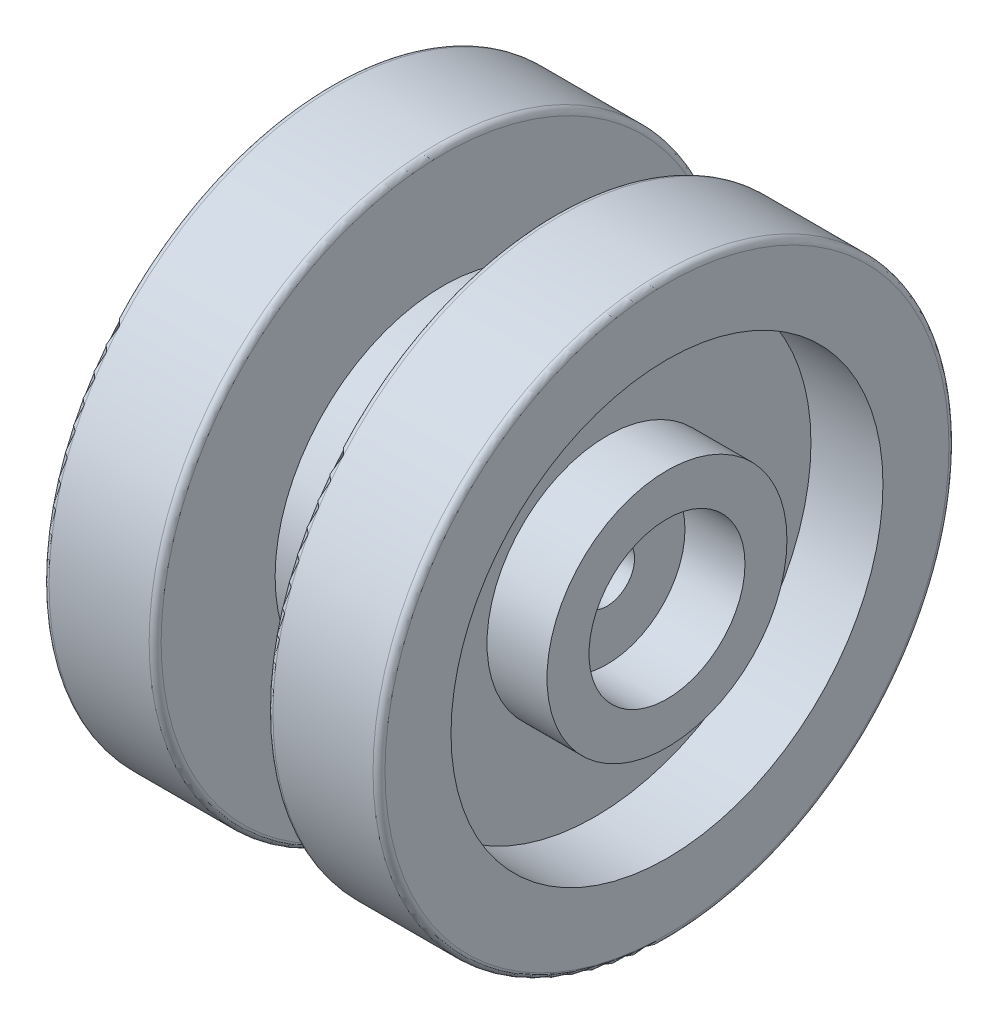
ISO-10303-21;
HEADER;
FILE_DESCRIPTION(('STEP AP214'),'2;1');
FILE_NAME('part.step','',(''),(''),'','','');
FILE_SCHEMA(('AUTOMOTIVE_DESIGN { 1 0 10303 214 1 1 1 1 }'));
ENDSEC;
DATA;
#1=APPLICATION_CONTEXT('core data for automotive mechanical design processes');
#2=APPLICATION_PROTOCOL_DEFINITION('international standard','automotive_design',2000,#1);
#3=PRODUCT_CONTEXT('',#1,'mechanical');
#4=PRODUCT('Part','Part','',(#3));
#5=PRODUCT_RELATED_PRODUCT_CATEGORY('part','',(#4));
#6=PRODUCT_DEFINITION_FORMATION('','',#4);
#7=PRODUCT_DEFINITION_CONTEXT('part definition',#1,'design');
#8=PRODUCT_DEFINITION('design','',#6,#7);
#9=PRODUCT_DEFINITION_SHAPE('','',#8);
#10=(LENGTH_UNIT() NAMED_UNIT(*) SI_UNIT(.MILLI.,.METRE.));
#11=(NAMED_UNIT(*) PLANE_ANGLE_UNIT() SI_UNIT($,.RADIAN.));
#12=(NAMED_UNIT(*) SI_UNIT($,.STERADIAN.) SOLID_ANGLE_UNIT());
#13=UNCERTAINTY_MEASURE_WITH_UNIT(LENGTH_MEASURE(1.E-05),#10,'distance_accuracy_value','');
#14=(GEOMETRIC_REPRESENTATION_CONTEXT(3) GLOBAL_UNCERTAINTY_ASSIGNED_CONTEXT((#13)) GLOBAL_UNIT_ASSIGNED_CONTEXT((#10,
#11,#12)) REPRESENTATION_CONTEXT('',''));
#15=CARTESIAN_POINT('',(0.,0.,0.));
#16=DIRECTION('',(0.,0.,1.));
#17=DIRECTION('',(1.,0.,0.));
#18=AXIS2_PLACEMENT_3D('',#15,#16,#17);
#19=CARTESIAN_POINT('',(6.57479912463906,-18.4842605379604,0.));
#20=DIRECTION('',(1.,0.,0.));
#21=DIRECTION('',(0.,0.,-1.));
#22=AXIS2_PLACEMENT_3D('',#19,#20,#21);
#23=CYLINDRICAL_SURFACE('',#22,8.);
#24=CARTESIAN_POINT('',(10.5747991246391,-18.4842605379604,0.));
#25=DIRECTION('',(1.,0.,0.));
#26=DIRECTION('',(0.,0.,-1.));
#27=AXIS2_PLACEMENT_3D('',#24,#25,#26);
#28=CIRCLE('',#27,8.);
#29=CARTESIAN_POINT('',(10.5747991246391,-18.4842605379604,-8.));
#30=VERTEX_POINT('',#29);
#31=EDGE_CURVE('E10',#30,#30,#28,.T.);
#32=ORIENTED_EDGE('',*,*,#31,.T.);
#33=EDGE_LOOP('',(#32));
#34=FACE_BOUND('',#33,.T.);
#35=CARTESIAN_POINT('',(11.5747991246391,-18.4842605379604,0.));
#36=DIRECTION('',(1.,0.,0.));
#37=DIRECTION('',(0.,0.,-1.));
#38=AXIS2_PLACEMENT_3D('',#35,#36,#37);
#39=CIRCLE('',#38,8.);
#40=CARTESIAN_POINT('',(11.5747991246391,-18.4842605379604,-8.));
#41=VERTEX_POINT('',#40);
#42=EDGE_CURVE('E54',#41,#41,#39,.F.);
#43=ORIENTED_EDGE('',*,*,#42,.T.);
#44=EDGE_LOOP('',(#43));
#45=FACE_BOUND('',#44,.T.);
#46=ADVANCED_FACE('F39',(#34,#45),#23,.T.);
#47=CARTESIAN_POINT('',(-2.08520087536094,-4.48426053796036,0.));
#48=DIRECTION('',(-1.,0.,0.));
#49=DIRECTION('',(0.,0.,1.));
#50=AXIS2_PLACEMENT_3D('',#47,#48,#49);
#51=PLANE('',#50);
#52=CARTESIAN_POINT('',(-2.08520087536094,-18.4842605379604,0.));
#53=DIRECTION('',(-1.,0.,0.));
#54=DIRECTION('',(0.,0.,1.));
#55=AXIS2_PLACEMENT_3D('',#52,#53,#54);
#56=CIRCLE('',#55,23.5);
#57=CARTESIAN_POINT('',(-2.08520087536094,-18.4842605379604,23.5));
#58=VERTEX_POINT('',#57);
#59=EDGE_CURVE('E55',#58,#58,#56,.F.);
#60=ORIENTED_EDGE('',*,*,#59,.T.);
#61=EDGE_LOOP('',(#60));
#62=FACE_BOUND('',#61,.T.);
#63=CARTESIAN_POINT('',(-2.08520087536094,-18.4842605379604,0.));
#64=DIRECTION('',(-1.,0.,0.));
#65=DIRECTION('',(0.,0.,1.));
#66=AXIS2_PLACEMENT_3D('',#63,#64,#65);
#67=CIRCLE('',#66,14.);
#68=CARTESIAN_POINT('',(-2.08520087536094,-18.4842605379604,14.));
#69=VERTEX_POINT('',#68);
#70=EDGE_CURVE('E94',#69,#69,#67,.T.);
#71=ORIENTED_EDGE('',*,*,#70,.T.);
#72=EDGE_LOOP('',(#71));
#73=FACE_BOUND('',#72,.T.);
#74=ADVANCED_FACE('F125',(#62,#73),#51,.F.);
#75=CARTESIAN_POINT('',(-11.4252008753609,-18.4842605379604,0.));
#76=DIRECTION('',(-1.,0.,0.));
#77=DIRECTION('',(0.,0.,1.));
#78=AXIS2_PLACEMENT_3D('',#75,#76,#77);
#79=CYLINDRICAL_SURFACE('',#78,24.);
#80=CARTESIAN_POINT('',(-10.9252008753609,-18.4842605379604,0.));
#81=DIRECTION('',(1.,0.,0.));
#82=DIRECTION('',(0.,0.,-1.));
#83=AXIS2_PLACEMENT_3D('',#80,#81,#82);
#84=CIRCLE('',#83,24.);
#85=CARTESIAN_POINT('',(-10.9252008753609,-18.4842605379604,-24.));
#86=VERTEX_POINT('',#85);
#87=EDGE_CURVE('E120',#86,#86,#84,.T.);
#88=ORIENTED_EDGE('',*,*,#87,.T.);
#89=EDGE_LOOP('',(#88));
#90=FACE_BOUND('',#89,.T.);
#91=CARTESIAN_POINT('',(-2.58520087536094,-18.4842605379604,0.));
#92=DIRECTION('',(-1.,0.,0.));
#93=DIRECTION('',(0.,0.,1.));
#94=AXIS2_PLACEMENT_3D('',#91,#92,#93);
#95=CIRCLE('',#94,24.);
#96=CARTESIAN_POINT('',(-2.58520087536094,-18.4842605379604,24.));
#97=VERTEX_POINT('',#96);
#98=EDGE_CURVE('E112',#97,#97,#95,.T.);
#99=ORIENTED_EDGE('',*,*,#98,.T.);
#100=EDGE_LOOP('',(#99));
#101=FACE_BOUND('',#100,.T.);
#102=ADVANCED_FACE('F132',(#90,#101),#79,.T.);
#103=CARTESIAN_POINT('',(-11.4252008753609,5.51573946203964,0.));
#104=DIRECTION('',(1.,0.,0.));
#105=DIRECTION('',(0.,0.,-1.));
#106=AXIS2_PLACEMENT_3D('',#103,#104,#105);
#107=PLANE('',#106);
#108=CARTESIAN_POINT('',(-11.4252008753609,-18.4842605379604,0.));
#109=DIRECTION('',(-1.,0.,0.));
#110=DIRECTION('',(0.,0.,1.));
#111=AXIS2_PLACEMENT_3D('',#108,#109,#110);
#112=CIRCLE('',#111,18.);
#113=CARTESIAN_POINT('',(-11.4252008753609,-18.4842605379604,18.));
#114=VERTEX_POINT('',#113);
#115=EDGE_CURVE('E85',#114,#114,#112,.T.);
#116=ORIENTED_EDGE('',*,*,#115,.F.);
#117=EDGE_LOOP('',(#116));
#118=FACE_BOUND('',#117,.T.);
#119=CARTESIAN_POINT('',(-11.4252008753609,-18.4842605379604,0.));
#120=DIRECTION('',(1.,0.,0.));
#121=DIRECTION('',(0.,0.,-1.));
#122=AXIS2_PLACEMENT_3D('',#119,#120,#121);
#123=CIRCLE('',#122,23.5);
#124=CARTESIAN_POINT('',(-11.4252008753609,-18.4842605379604,-23.5));
#125=VERTEX_POINT('',#124);
#126=EDGE_CURVE('E111',#125,#125,#123,.F.);
#127=ORIENTED_EDGE('',*,*,#126,.T.);
#128=EDGE_LOOP('',(#127));
#129=FACE_BOUND('',#128,.T.);
#130=ADVANCED_FACE('F135',(#118,#129),#107,.F.);
#131=CARTESIAN_POINT('',(16.5747991246391,-18.4842605379604,0.));
#132=DIRECTION('',(-1.,0.,0.));
#133=DIRECTION('',(0.,0.,1.));
#134=AXIS2_PLACEMENT_3D('',#131,#132,#133);
#135=PLANE('',#134);
#136=CARTESIAN_POINT('',(16.5747991246391,-18.4842605379604,0.));
#137=DIRECTION('',(1.,0.,0.));
#138=DIRECTION('',(0.,0.,-1.));
#139=AXIS2_PLACEMENT_3D('',#136,#137,#138);
#140=CIRCLE('',#139,18.);
#141=CARTESIAN_POINT('',(16.5747991246391,-18.4842605379604,-18.));
#142=VERTEX_POINT('',#141);
#143=EDGE_CURVE('E90',#142,#142,#140,.T.);
#144=ORIENTED_EDGE('',*,*,#143,.F.);
#145=EDGE_LOOP('',(#144));
#146=FACE_BOUND('',#145,.T.);
#147=CARTESIAN_POINT('',(16.5747991246391,-18.4842605379604,0.));
#148=DIRECTION('',(-1.,0.,0.));
#149=DIRECTION('',(0.,0.,1.));
#150=AXIS2_PLACEMENT_3D('',#147,#148,#149);
#151=CIRCLE('',#150,23.5);
#152=CARTESIAN_POINT('',(16.5747991246391,-18.4842605379604,23.5));
#153=VERTEX_POINT('',#152);
#154=EDGE_CURVE('E108',#153,#153,#151,.F.);
#155=ORIENTED_EDGE('',*,*,#154,.T.);
#156=EDGE_LOOP('',(#155));
#157=FACE_BOUND('',#156,.T.);
#158=ADVANCED_FACE('F142',(#146,#157),#135,.F.);
#159=CARTESIAN_POINT('',(-11.4252008753609,-18.4842605379604,0.));
#160=DIRECTION('',(-1.,0.,0.));
#161=DIRECTION('',(0.,0.,1.));
#162=AXIS2_PLACEMENT_3D('',#159,#160,#161);
#163=CYLINDRICAL_SURFACE('',#162,24.);
#164=CARTESIAN_POINT('',(16.0747991246391,-18.4842605379604,0.));
#165=DIRECTION('',(-1.,0.,0.));
#166=DIRECTION('',(0.,0.,1.));
#167=AXIS2_PLACEMENT_3D('',#164,#165,#166);
#168=CIRCLE('',#167,24.);
#169=CARTESIAN_POINT('',(16.0747991246391,-18.4842605379604,24.));
#170=VERTEX_POINT('',#169);
#171=EDGE_CURVE('E102',#170,#170,#168,.T.);
#172=ORIENTED_EDGE('',*,*,#171,.T.);
#173=EDGE_LOOP('',(#172));
#174=FACE_BOUND('',#173,.T.);
#175=CARTESIAN_POINT('',(7.73479912463906,-18.4842605379604,0.));
#176=DIRECTION('',(1.,0.,0.));
#177=DIRECTION('',(0.,0.,-1.));
#178=AXIS2_PLACEMENT_3D('',#175,#176,#177);
#179=CIRCLE('',#178,24.);
#180=CARTESIAN_POINT('',(7.73479912463906,-18.4842605379604,-24.));
#181=VERTEX_POINT('',#180);
#182=EDGE_CURVE('E105',#181,#181,#179,.T.);
#183=ORIENTED_EDGE('',*,*,#182,.T.);
#184=EDGE_LOOP('',(#183));
#185=FACE_BOUND('',#184,.T.);
#186=ADVANCED_FACE('F190',(#174,#185),#163,.T.);
#187=CARTESIAN_POINT('',(7.23479912463906,-4.48426053796036,0.));
#188=DIRECTION('',(1.,0.,0.));
#189=DIRECTION('',(0.,0.,-1.));
#190=AXIS2_PLACEMENT_3D('',#187,#188,#189);
#191=PLANE('',#190);
#192=CARTESIAN_POINT('',(7.23479912463906,-18.4842605379604,0.));
#193=DIRECTION('',(1.,0.,0.));
#194=DIRECTION('',(0.,0.,-1.));
#195=AXIS2_PLACEMENT_3D('',#192,#193,#194);
#196=CIRCLE('',#195,23.5);
#197=CARTESIAN_POINT('',(7.23479912463906,-18.4842605379604,-23.5));
#198=VERTEX_POINT('',#197);
#199=EDGE_CURVE('E50',#198,#198,#196,.F.);
#200=ORIENTED_EDGE('',*,*,#199,.T.);
#201=EDGE_LOOP('',(#200));
#202=FACE_BOUND('',#201,.T.);
#203=CARTESIAN_POINT('',(7.23479912463906,-18.4842605379604,0.));
#204=DIRECTION('',(-1.,0.,0.));
#205=DIRECTION('',(0.,0.,1.));
#206=AXIS2_PLACEMENT_3D('',#203,#204,#205);
#207=CIRCLE('',#206,14.);
#208=CARTESIAN_POINT('',(7.23479912463906,-18.4842605379604,14.));
#209=VERTEX_POINT('',#208);
#210=EDGE_CURVE('E100',#209,#209,#207,.T.);
#211=ORIENTED_EDGE('',*,*,#210,.F.);
#212=EDGE_LOOP('',(#211));
#213=FACE_BOUND('',#212,.T.);
#214=ADVANCED_FACE('F182',(#202,#213),#191,.F.);
#215=CARTESIAN_POINT('',(-11.4252008753609,-18.4842605379604,0.));
#216=DIRECTION('',(-1.,0.,0.));
#217=DIRECTION('',(0.,0.,1.));
#218=AXIS2_PLACEMENT_3D('',#215,#216,#217);
#219=CYLINDRICAL_SURFACE('',#218,14.);
#220=ORIENTED_EDGE('',*,*,#70,.F.);
#221=EDGE_LOOP('',(#220));
#222=FACE_BOUND('',#221,.T.);
#223=ORIENTED_EDGE('',*,*,#210,.T.);
#224=EDGE_LOOP('',(#223));
#225=FACE_BOUND('',#224,.T.);
#226=ADVANCED_FACE('F177',(#222,#225),#219,.T.);
#227=CARTESIAN_POINT('',(16.0747991246391,-18.4842605379604,0.));
#228=DIRECTION('',(-1.,0.,0.));
#229=DIRECTION('',(0.,0.,1.));
#230=AXIS2_PLACEMENT_3D('',#227,#228,#229);
#231=TOROIDAL_SURFACE('',#230,23.5,0.5);
#232=ORIENTED_EDGE('',*,*,#154,.F.);
#233=EDGE_LOOP('',(#232));
#234=FACE_BOUND('',#233,.T.);
#235=ORIENTED_EDGE('',*,*,#171,.F.);
#236=EDGE_LOOP('',(#235));
#237=FACE_BOUND('',#236,.T.);
#238=ADVANCED_FACE('F185',(#234,#237),#231,.T.);
#239=CARTESIAN_POINT('',(-10.9252008753609,-18.4842605379604,0.));
#240=DIRECTION('',(1.,0.,0.));
#241=DIRECTION('',(0.,0.,-1.));
#242=AXIS2_PLACEMENT_3D('',#239,#240,#241);
#243=TOROIDAL_SURFACE('',#242,23.5,0.5);
#244=ORIENTED_EDGE('',*,*,#87,.F.);
#245=EDGE_LOOP('',(#244));
#246=FACE_BOUND('',#245,.T.);
#247=ORIENTED_EDGE('',*,*,#126,.F.);
#248=EDGE_LOOP('',(#247));
#249=FACE_BOUND('',#248,.T.);
#250=ADVANCED_FACE('F127',(#246,#249),#243,.T.);
#251=CARTESIAN_POINT('',(-2.58520087536094,-18.4842605379604,0.));
#252=DIRECTION('',(-1.,0.,0.));
#253=DIRECTION('',(0.,0.,1.));
#254=AXIS2_PLACEMENT_3D('',#251,#252,#253);
#255=TOROIDAL_SURFACE('',#254,23.5,0.5);
#256=ORIENTED_EDGE('',*,*,#59,.F.);
#257=EDGE_LOOP('',(#256));
#258=FACE_BOUND('',#257,.T.);
#259=ORIENTED_EDGE('',*,*,#98,.F.);
#260=EDGE_LOOP('',(#259));
#261=FACE_BOUND('',#260,.T.);
#262=ADVANCED_FACE('F123',(#258,#261),#255,.T.);
#263=CARTESIAN_POINT('',(7.73479912463906,-18.4842605379604,0.));
#264=DIRECTION('',(1.,0.,0.));
#265=DIRECTION('',(0.,0.,-1.));
#266=AXIS2_PLACEMENT_3D('',#263,#264,#265);
#267=TOROIDAL_SURFACE('',#266,23.5,0.5);
#268=ORIENTED_EDGE('',*,*,#182,.F.);
#269=EDGE_LOOP('',(#268));
#270=FACE_BOUND('',#269,.T.);
#271=ORIENTED_EDGE('',*,*,#199,.F.);
#272=EDGE_LOOP('',(#271));
#273=FACE_BOUND('',#272,.T.);
#274=ADVANCED_FACE('F41',(#270,#273),#267,.T.);
#275=CARTESIAN_POINT('',(10.5747991246391,-18.4842605379604,0.));
#276=DIRECTION('',(1.,0.,0.));
#277=DIRECTION('',(0.,0.,-1.));
#278=AXIS2_PLACEMENT_3D('',#275,#276,#277);
#279=CYLINDRICAL_SURFACE('',#278,18.);
#280=CARTESIAN_POINT('',(10.5747991246391,-18.4842605379604,0.));
#281=DIRECTION('',(1.,0.,0.));
#282=DIRECTION('',(0.,0.,-1.));
#283=AXIS2_PLACEMENT_3D('',#280,#281,#282);
#284=CIRCLE('',#283,18.);
#285=CARTESIAN_POINT('',(10.5747991246391,-18.4842605379604,-18.));
#286=VERTEX_POINT('',#285);
#287=EDGE_CURVE('E92',#286,#286,#284,.T.);
#288=ORIENTED_EDGE('',*,*,#287,.F.);
#289=EDGE_LOOP('',(#288));
#290=FACE_BOUND('',#289,.T.);
#291=ORIENTED_EDGE('',*,*,#143,.T.);
#292=EDGE_LOOP('',(#291));
#293=FACE_BOUND('',#292,.T.);
#294=ADVANCED_FACE('F172',(#290,#293),#279,.F.);
#295=CARTESIAN_POINT('',(10.5747991246391,-18.4842605379604,0.));
#296=DIRECTION('',(1.,0.,0.));
#297=DIRECTION('',(0.,0.,-1.));
#298=AXIS2_PLACEMENT_3D('',#295,#296,#297);
#299=PLANE('',#298);
#300=ORIENTED_EDGE('',*,*,#31,.F.);
#301=EDGE_LOOP('',(#300));
#302=FACE_BOUND('',#301,.T.);
#303=ORIENTED_EDGE('',*,*,#287,.T.);
#304=EDGE_LOOP('',(#303));
#305=FACE_BOUND('',#304,.T.);
#306=ADVANCED_FACE('F170',(#302,#305),#299,.T.);
#307=CARTESIAN_POINT('',(-5.42520087536094,-18.4842605379604,0.));
#308=DIRECTION('',(-1.,0.,0.));
#309=DIRECTION('',(0.,0.,1.));
#310=AXIS2_PLACEMENT_3D('',#307,#308,#309);
#311=PLANE('',#310);
#312=CARTESIAN_POINT('',(-5.42520087536094,-18.4842605379604,0.));
#313=DIRECTION('',(-1.,0.,0.));
#314=DIRECTION('',(0.,0.,1.));
#315=AXIS2_PLACEMENT_3D('',#312,#313,#314);
#316=CIRCLE('',#315,10.);
#317=CARTESIAN_POINT('',(-5.42520087536094,-18.4842605379604,10.));
#318=VERTEX_POINT('',#317);
#319=EDGE_CURVE('E80',#318,#318,#316,.T.);
#320=ORIENTED_EDGE('',*,*,#319,.F.);
#321=EDGE_LOOP('',(#320));
#322=FACE_BOUND('',#321,.T.);
#323=CARTESIAN_POINT('',(-5.42520087536094,-18.4842605379604,0.));
#324=DIRECTION('',(-1.,0.,0.));
#325=DIRECTION('',(0.,0.,1.));
#326=AXIS2_PLACEMENT_3D('',#323,#324,#325);
#327=CIRCLE('',#326,18.);
#328=CARTESIAN_POINT('',(-5.42520087536094,-18.4842605379604,18.));
#329=VERTEX_POINT('',#328);
#330=EDGE_CURVE('E84',#329,#329,#327,.T.);
#331=ORIENTED_EDGE('',*,*,#330,.T.);
#332=EDGE_LOOP('',(#331));
#333=FACE_BOUND('',#332,.T.);
#334=ADVANCED_FACE('F165',(#322,#333),#311,.T.);
#335=CARTESIAN_POINT('',(-5.42520087536094,-18.4842605379604,0.));
#336=DIRECTION('',(-1.,0.,0.));
#337=DIRECTION('',(0.,0.,1.));
#338=AXIS2_PLACEMENT_3D('',#335,#336,#337);
#339=CYLINDRICAL_SURFACE('',#338,18.);
#340=ORIENTED_EDGE('',*,*,#330,.F.);
#341=EDGE_LOOP('',(#340));
#342=FACE_BOUND('',#341,.T.);
#343=ORIENTED_EDGE('',*,*,#115,.T.);
#344=EDGE_LOOP('',(#343));
#345=FACE_BOUND('',#344,.T.);
#346=ADVANCED_FACE('F159',(#342,#345),#339,.F.);
#347=CARTESIAN_POINT('',(-11.4252008753609,-18.4842605379604,0.));
#348=DIRECTION('',(-1.,0.,0.));
#349=DIRECTION('',(0.,0.,1.));
#350=AXIS2_PLACEMENT_3D('',#347,#348,#349);
#351=PLANE('',#350);
#352=CARTESIAN_POINT('',(-11.4252008753609,-18.4842605379604,0.));
#353=DIRECTION('',(-1.,0.,0.));
#354=DIRECTION('',(0.,0.,1.));
#355=AXIS2_PLACEMENT_3D('',#352,#353,#354);
#356=CIRCLE('',#355,6.5);
#357=CARTESIAN_POINT('',(-11.4252008753609,-18.4842605379604,6.5));
#358=VERTEX_POINT('',#357);
#359=EDGE_CURVE('E60',#358,#358,#356,.T.);
#360=ORIENTED_EDGE('',*,*,#359,.F.);
#361=EDGE_LOOP('',(#360));
#362=FACE_BOUND('',#361,.T.);
#363=CARTESIAN_POINT('',(-11.4252008753609,-18.4842605379604,0.));
#364=DIRECTION('',(-1.,0.,0.));
#365=DIRECTION('',(0.,0.,1.));
#366=AXIS2_PLACEMENT_3D('',#363,#364,#365);
#367=CIRCLE('',#366,10.);
#368=CARTESIAN_POINT('',(-11.4252008753609,-18.4842605379604,10.));
#369=VERTEX_POINT('',#368);
#370=EDGE_CURVE('E79',#369,#369,#367,.T.);
#371=ORIENTED_EDGE('',*,*,#370,.T.);
#372=EDGE_LOOP('',(#371));
#373=FACE_BOUND('',#372,.T.);
#374=ADVANCED_FACE('F153',(#362,#373),#351,.T.);
#375=CARTESIAN_POINT('',(-11.4252008753609,-18.4842605379604,0.));
#376=DIRECTION('',(1.,0.,0.));
#377=DIRECTION('',(0.,0.,-1.));
#378=AXIS2_PLACEMENT_3D('',#375,#376,#377);
#379=CYLINDRICAL_SURFACE('',#378,10.);
#380=ORIENTED_EDGE('',*,*,#370,.F.);
#381=EDGE_LOOP('',(#380));
#382=FACE_BOUND('',#381,.T.);
#383=ORIENTED_EDGE('',*,*,#319,.T.);
#384=EDGE_LOOP('',(#383));
#385=FACE_BOUND('',#384,.T.);
#386=ADVANCED_FACE('F158',(#382,#385),#379,.T.);
#387=CARTESIAN_POINT('',(-6.42520087536094,-18.4842605379604,0.));
#388=DIRECTION('',(-1.,0.,0.));
#389=DIRECTION('',(0.,0.,1.));
#390=AXIS2_PLACEMENT_3D('',#387,#388,#389);
#391=CYLINDRICAL_SURFACE('',#390,6.5);
#392=CARTESIAN_POINT('',(-6.42520087536094,-18.4842605379604,0.));
#393=DIRECTION('',(-1.,0.,0.));
#394=DIRECTION('',(0.,0.,1.));
#395=AXIS2_PLACEMENT_3D('',#392,#393,#394);
#396=CIRCLE('',#395,6.5);
#397=CARTESIAN_POINT('',(-6.42520087536094,-18.4842605379604,6.5));
#398=VERTEX_POINT('',#397);
#399=EDGE_CURVE('E65',#398,#398,#396,.T.);
#400=ORIENTED_EDGE('',*,*,#399,.F.);
#401=EDGE_LOOP('',(#400));
#402=FACE_BOUND('',#401,.T.);
#403=ORIENTED_EDGE('',*,*,#359,.T.);
#404=EDGE_LOOP('',(#403));
#405=FACE_BOUND('',#404,.T.);
#406=ADVANCED_FACE('F155',(#402,#405),#391,.F.);
#407=CARTESIAN_POINT('',(-6.42520087536094,-18.4842605379604,0.));
#408=DIRECTION('',(-1.,0.,0.));
#409=DIRECTION('',(0.,0.,1.));
#410=AXIS2_PLACEMENT_3D('',#407,#408,#409);
#411=PLANE('',#410);
#412=CARTESIAN_POINT('',(-6.42520087536094,-18.4842605379604,0.));
#413=DIRECTION('',(-1.,0.,0.));
#414=DIRECTION('',(0.,0.,1.));
#415=AXIS2_PLACEMENT_3D('',#412,#413,#414);
#416=CIRCLE('',#415,2.3);
#417=CARTESIAN_POINT('',(-6.42520087536094,-18.4842605379604,2.3));
#418=VERTEX_POINT('',#417);
#419=EDGE_CURVE('E236',#418,#418,#416,.T.);
#420=ORIENTED_EDGE('',*,*,#419,.F.);
#421=EDGE_LOOP('',(#420));
#422=FACE_BOUND('',#421,.T.);
#423=ORIENTED_EDGE('',*,*,#399,.T.);
#424=EDGE_LOOP('',(#423));
#425=FACE_BOUND('',#424,.T.);
#426=ADVANCED_FACE('F220',(#422,#425),#411,.T.);
#427=CARTESIAN_POINT('',(11.5747991246391,-18.4842605379604,0.));
#428=DIRECTION('',(1.,0.,0.));
#429=DIRECTION('',(0.,0.,-1.));
#430=AXIS2_PLACEMENT_3D('',#427,#428,#429);
#431=CYLINDRICAL_SURFACE('',#430,10.);
#432=CARTESIAN_POINT('',(11.5747991246391,-18.4842605379604,0.));
#433=DIRECTION('',(1.,0.,0.));
#434=DIRECTION('',(0.,0.,-1.));
#435=AXIS2_PLACEMENT_3D('',#432,#433,#434);
#436=CIRCLE('',#435,10.);
#437=CARTESIAN_POINT('',(11.5747991246391,-18.4842605379604,-10.));
#438=VERTEX_POINT('',#437);
#439=EDGE_CURVE('E59',#438,#438,#436,.T.);
#440=ORIENTED_EDGE('',*,*,#439,.T.);
#441=EDGE_LOOP('',(#440));
#442=FACE_BOUND('',#441,.T.);
#443=CARTESIAN_POINT('',(16.5747991246391,-18.4842605379604,0.));
#444=DIRECTION('',(1.,0.,0.));
#445=DIRECTION('',(0.,0.,-1.));
#446=AXIS2_PLACEMENT_3D('',#443,#444,#445);
#447=CIRCLE('',#446,10.);
#448=CARTESIAN_POINT('',(16.5747991246391,-18.4842605379604,-10.));
#449=VERTEX_POINT('',#448);
#450=EDGE_CURVE('E64',#449,#449,#447,.T.);
#451=ORIENTED_EDGE('',*,*,#450,.F.);
#452=EDGE_LOOP('',(#451));
#453=FACE_BOUND('',#452,.T.);
#454=ADVANCED_FACE('F208',(#442,#453),#431,.T.);
#455=CARTESIAN_POINT('',(11.5747991246391,-18.4842605379604,0.));
#456=DIRECTION('',(1.,0.,0.));
#457=DIRECTION('',(0.,0.,-1.));
#458=AXIS2_PLACEMENT_3D('',#455,#456,#457);
#459=PLANE('',#458);
#460=ORIENTED_EDGE('',*,*,#42,.F.);
#461=EDGE_LOOP('',(#460));
#462=FACE_BOUND('',#461,.T.);
#463=ORIENTED_EDGE('',*,*,#439,.F.);
#464=EDGE_LOOP('',(#463));
#465=FACE_BOUND('',#464,.T.);
#466=ADVANCED_FACE('F202',(#462,#465),#459,.F.);
#467=CARTESIAN_POINT('',(16.5747991246391,-18.4842605379604,0.));
#468=DIRECTION('',(1.,0.,0.));
#469=DIRECTION('',(0.,0.,-1.));
#470=AXIS2_PLACEMENT_3D('',#467,#468,#469);
#471=CIRCLE('',#470,6.5);
#472=CARTESIAN_POINT('',(16.5747991246391,-18.4842605379604,-6.5));
#473=VERTEX_POINT('',#472);
#474=EDGE_CURVE('E73',#473,#473,#471,.T.);
#475=ORIENTED_EDGE('',*,*,#474,.F.);
#476=EDGE_LOOP('',(#475));
#477=FACE_BOUND('',#476,.T.);
#478=ORIENTED_EDGE('',*,*,#450,.T.);
#479=EDGE_LOOP('',(#478));
#480=FACE_BOUND('',#479,.T.);
#481=ADVANCED_FACE('F192',(#477,#480),#135,.F.);
#482=CARTESIAN_POINT('',(11.5747991246391,-18.4842605379604,0.));
#483=DIRECTION('',(1.,0.,0.));
#484=DIRECTION('',(0.,0.,-1.));
#485=AXIS2_PLACEMENT_3D('',#482,#483,#484);
#486=CYLINDRICAL_SURFACE('',#485,6.5);
#487=CARTESIAN_POINT('',(11.5747991246391,-18.4842605379604,0.));
#488=DIRECTION('',(1.,0.,0.));
#489=DIRECTION('',(0.,0.,-1.));
#490=AXIS2_PLACEMENT_3D('',#487,#488,#489);
#491=CIRCLE('',#490,6.5);
#492=CARTESIAN_POINT('',(11.5747991246391,-18.4842605379604,-6.5));
#493=VERTEX_POINT('',#492);
#494=EDGE_CURVE('E68',#493,#493,#491,.T.);
#495=ORIENTED_EDGE('',*,*,#494,.F.);
#496=EDGE_LOOP('',(#495));
#497=FACE_BOUND('',#496,.T.);
#498=ORIENTED_EDGE('',*,*,#474,.T.);
#499=EDGE_LOOP('',(#498));
#500=FACE_BOUND('',#499,.T.);
#501=ADVANCED_FACE('F198',(#497,#500),#486,.F.);
#502=CARTESIAN_POINT('',(11.5747991246391,-18.4842605379604,0.));
#503=DIRECTION('',(1.,0.,0.));
#504=DIRECTION('',(0.,0.,-1.));
#505=AXIS2_PLACEMENT_3D('',#502,#503,#504);
#506=PLANE('',#505);
#507=CARTESIAN_POINT('',(11.5747991246391,-18.4842605379604,0.));
#508=DIRECTION('',(1.,0.,0.));
#509=DIRECTION('',(0.,0.,-1.));
#510=AXIS2_PLACEMENT_3D('',#507,#508,#509);
#511=CIRCLE('',#510,2.3);
#512=CARTESIAN_POINT('',(11.5747991246391,-18.4842605379604,2.3));
#513=VERTEX_POINT('',#512);
#514=EDGE_CURVE('E43',#513,#513,#511,.T.);
#515=ORIENTED_EDGE('',*,*,#514,.F.);
#516=EDGE_LOOP('',(#515));
#517=FACE_BOUND('',#516,.T.);
#518=ORIENTED_EDGE('',*,*,#494,.T.);
#519=EDGE_LOOP('',(#518));
#520=FACE_BOUND('',#519,.T.);
#521=ADVANCED_FACE('F210',(#517,#520),#506,.T.);
#522=CARTESIAN_POINT('',(16.5747991246391,-18.4842605379604,0.));
#523=DIRECTION('',(-1.,0.,0.));
#524=DIRECTION('',(0.,0.,1.));
#525=AXIS2_PLACEMENT_3D('',#522,#523,#524);
#526=CYLINDRICAL_SURFACE('',#525,2.3);
#527=CARTESIAN_POINT('',(-6.42520087536094,-18.4842605379604,2.3));
#528=CARTESIAN_POINT('',(-6.23770087536094,-18.4842605379604,2.3));
#529=CARTESIAN_POINT('',(-6.05020087536094,-18.4842605379604,2.3));
#530=CARTESIAN_POINT('',(-5.67520087536094,-18.4842605379604,2.3));
#531=CARTESIAN_POINT('',(-5.48770087536094,-18.4842605379604,2.3));
#532=CARTESIAN_POINT('',(-5.11270087536094,-18.4842605379604,2.3));
#533=CARTESIAN_POINT('',(-4.92520087536094,-18.4842605379604,2.3));
#534=CARTESIAN_POINT('',(-4.55020087536094,-18.4842605379604,2.3));
#535=CARTESIAN_POINT('',(-4.36270087536094,-18.4842605379604,2.3));
#536=CARTESIAN_POINT('',(-3.98770087536094,-18.4842605379604,2.3));
#537=CARTESIAN_POINT('',(-3.80020087536094,-18.4842605379604,2.3));
#538=CARTESIAN_POINT('',(-3.42520087536094,-18.4842605379604,2.3));
#539=CARTESIAN_POINT('',(-3.23770087536094,-18.4842605379604,2.3));
#540=CARTESIAN_POINT('',(-2.86270087536094,-18.4842605379604,2.3));
#541=CARTESIAN_POINT('',(-2.67520087536094,-18.4842605379604,2.3));
#542=CARTESIAN_POINT('',(-2.30020087536094,-18.4842605379604,2.3));
#543=CARTESIAN_POINT('',(-2.11270087536094,-18.4842605379604,2.3));
#544=CARTESIAN_POINT('',(-1.73770087536094,-18.4842605379604,2.3));
#545=CARTESIAN_POINT('',(-1.55020087536094,-18.4842605379604,2.3));
#546=CARTESIAN_POINT('',(-1.17520087536094,-18.4842605379604,2.3));
#547=CARTESIAN_POINT('',(-0.987700875360941,-18.4842605379604,2.3));
#548=CARTESIAN_POINT('',(-0.612700875360941,-18.4842605379604,2.3));
#549=CARTESIAN_POINT('',(-0.425200875360941,-18.4842605379604,2.3));
#550=CARTESIAN_POINT('',(-0.0502008753609402,-18.4842605379604,2.3));
#551=CARTESIAN_POINT('',(0.13729912463906,-18.4842605379604,2.3));
#552=CARTESIAN_POINT('',(0.51229912463906,-18.4842605379604,2.3));
#553=CARTESIAN_POINT('',(0.69979912463906,-18.4842605379604,2.3));
#554=CARTESIAN_POINT('',(1.07479912463906,-18.4842605379604,2.3));
#555=CARTESIAN_POINT('',(1.26229912463906,-18.4842605379604,2.3));
#556=CARTESIAN_POINT('',(1.63729912463906,-18.4842605379604,2.3));
#557=CARTESIAN_POINT('',(1.82479912463906,-18.4842605379604,2.3));
#558=CARTESIAN_POINT('',(2.19979912463906,-18.4842605379604,2.3));
#559=CARTESIAN_POINT('',(2.38729912463906,-18.4842605379604,2.3));
#560=CARTESIAN_POINT('',(2.76229912463906,-18.4842605379604,2.3));
#561=CARTESIAN_POINT('',(2.94979912463906,-18.4842605379604,2.3));
#562=CARTESIAN_POINT('',(3.32479912463906,-18.4842605379604,2.3));
#563=CARTESIAN_POINT('',(3.51229912463906,-18.4842605379604,2.3));
#564=CARTESIAN_POINT('',(3.88729912463906,-18.4842605379604,2.3));
#565=CARTESIAN_POINT('',(4.07479912463906,-18.4842605379604,2.3));
#566=CARTESIAN_POINT('',(4.44979912463906,-18.4842605379604,2.3));
#567=CARTESIAN_POINT('',(4.63729912463906,-18.4842605379604,2.3));
#568=CARTESIAN_POINT('',(5.01229912463906,-18.4842605379604,2.3));
#569=CARTESIAN_POINT('',(5.19979912463906,-18.4842605379604,2.3));
#570=CARTESIAN_POINT('',(5.57479912463906,-18.4842605379604,2.3));
#571=CARTESIAN_POINT('',(5.76229912463906,-18.4842605379604,2.3));
#572=CARTESIAN_POINT('',(6.13729912463906,-18.4842605379604,2.3));
#573=CARTESIAN_POINT('',(6.32479912463906,-18.4842605379604,2.3));
#574=CARTESIAN_POINT('',(6.69979912463906,-18.4842605379604,2.3));
#575=CARTESIAN_POINT('',(6.88729912463906,-18.4842605379604,2.3));
#576=CARTESIAN_POINT('',(7.26229912463906,-18.4842605379604,2.3));
#577=CARTESIAN_POINT('',(7.44979912463906,-18.4842605379604,2.3));
#578=CARTESIAN_POINT('',(7.82479912463906,-18.4842605379604,2.3));
#579=CARTESIAN_POINT('',(8.01229912463906,-18.4842605379604,2.3));
#580=CARTESIAN_POINT('',(8.38729912463906,-18.4842605379604,2.3));
#581=CARTESIAN_POINT('',(8.57479912463906,-18.4842605379604,2.3));
#582=CARTESIAN_POINT('',(8.94979912463906,-18.4842605379604,2.3));
#583=CARTESIAN_POINT('',(9.13729912463905,-18.4842605379604,2.3));
#584=CARTESIAN_POINT('',(9.51229912463906,-18.4842605379604,2.3));
#585=CARTESIAN_POINT('',(9.69979912463906,-18.4842605379604,2.3));
#586=CARTESIAN_POINT('',(10.0747991246391,-18.4842605379604,2.3));
#587=CARTESIAN_POINT('',(10.2622991246391,-18.4842605379604,2.3));
#588=CARTESIAN_POINT('',(10.6372991246391,-18.4842605379604,2.3));
#589=CARTESIAN_POINT('',(10.8247991246391,-18.4842605379604,2.3));
#590=CARTESIAN_POINT('',(11.1997991246391,-18.4842605379604,2.3));
#591=CARTESIAN_POINT('',(11.3872991246391,-18.4842605379604,2.3));
#592=CARTESIAN_POINT('',(11.5747991246391,-18.4842605379604,2.3));
#593=B_SPLINE_CURVE_WITH_KNOTS('',3,(#527,#528,#529,#530,#531,#532,#533,#534,#535,#536,#537,
#538,#539,#540,#541,#542,#543,#544,#545,#546,#547,#548,#549,#550,#551,#552,#553,#554,#555,#556,
#557,#558,#559,#560,#561,#562,#563,#564,#565,#566,#567,#568,#569,#570,#571,#572,#573,#574,#575,
#576,#577,#578,#579,#580,#581,#582,#583,#584,#585,#586,#587,#588,#589,#590,#591,#592),
.UNSPECIFIED.,.F.,.F.,(4,2,2,2,2,2,2,2,2,2,2,2,2,2,2,2,2,2,2,2,2,2,2,2,2,2,2,2,2,2,2,2,4),(0.,
0.5625,1.125,1.6875,2.25,2.8125,3.375,3.9375,4.5,5.0625,5.625,6.1875,6.75,7.3125,7.875,
8.43749999999999,9.,9.5625,10.125,10.6875,11.25,11.8125,12.375,12.9375,13.5,14.0625,14.625,
15.1875,15.75,16.3125,16.875,17.4375,18.),.UNSPECIFIED.);
#594=EDGE_CURVE('BSEAM227',#418,#513,#593,.T.);
#595=ORIENTED_EDGE('',*,*,#419,.T.);
#596=ORIENTED_EDGE('',*,*,#514,.T.);
#597=ORIENTED_EDGE('',*,*,#594,.T.);
#598=ORIENTED_EDGE('',*,*,#594,.F.);
#599=EDGE_LOOP('',(#595,#597,#596,#598));
#600=FACE_BOUND('',#599,.T.);
#601=ADVANCED_FACE('F227',(#600),#526,.F.);
#602=CLOSED_SHELL('',(#46,#74,#102,#130,#158,#186,#214,#226,#238,#250,#262,#274,#294,#306,#334,
#346,#374,#386,#406,#426,#454,#466,#481,#501,#521,#601));
#603=MANIFOLD_SOLID_BREP('B2',#602);
#604=ADVANCED_BREP_SHAPE_REPRESENTATION('',(#18,#603),#14);
#605=SHAPE_DEFINITION_REPRESENTATION(#9,#604);
ENDSEC;
END-ISO-10303-21;
